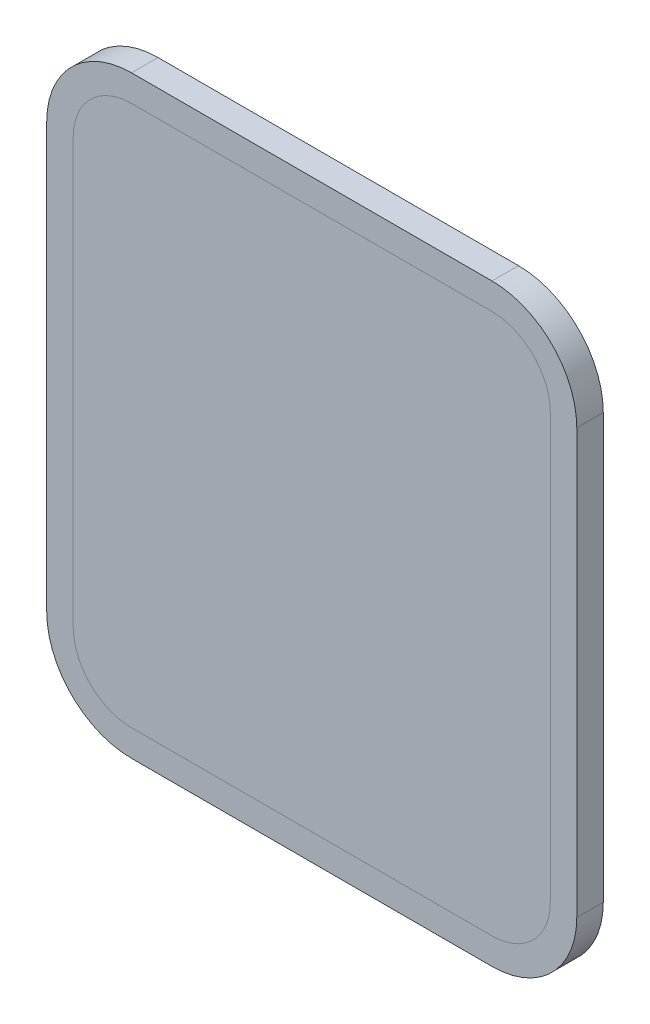
ISO-10303-21;
HEADER;
FILE_DESCRIPTION(('STEP AP214'),'2;1');
FILE_NAME('part.step','',(''),(''),'','','');
FILE_SCHEMA(('AUTOMOTIVE_DESIGN { 1 0 10303 214 1 1 1 1 }'));
ENDSEC;
DATA;
#1=APPLICATION_CONTEXT('core data for automotive mechanical design processes');
#2=APPLICATION_PROTOCOL_DEFINITION('international standard','automotive_design',2000,#1);
#3=PRODUCT_CONTEXT('',#1,'mechanical');
#4=PRODUCT('Part','Part','',(#3));
#5=PRODUCT_RELATED_PRODUCT_CATEGORY('part','',(#4));
#6=PRODUCT_DEFINITION_FORMATION('','',#4);
#7=PRODUCT_DEFINITION_CONTEXT('part definition',#1,'design');
#8=PRODUCT_DEFINITION('design','',#6,#7);
#9=PRODUCT_DEFINITION_SHAPE('','',#8);
#10=(LENGTH_UNIT() NAMED_UNIT(*) SI_UNIT(.MILLI.,.METRE.));
#11=(NAMED_UNIT(*) PLANE_ANGLE_UNIT() SI_UNIT($,.RADIAN.));
#12=(NAMED_UNIT(*) SI_UNIT($,.STERADIAN.) SOLID_ANGLE_UNIT());
#13=UNCERTAINTY_MEASURE_WITH_UNIT(LENGTH_MEASURE(1.E-05),#10,'distance_accuracy_value','');
#14=(GEOMETRIC_REPRESENTATION_CONTEXT(3) GLOBAL_UNCERTAINTY_ASSIGNED_CONTEXT((#13)) GLOBAL_UNIT_ASSIGNED_CONTEXT((#10,
#11,#12)) REPRESENTATION_CONTEXT('',''));
#15=CARTESIAN_POINT('',(0.,0.,0.));
#16=DIRECTION('',(0.,0.,1.));
#17=DIRECTION('',(1.,0.,0.));
#18=AXIS2_PLACEMENT_3D('',#15,#16,#17);
#19=CARTESIAN_POINT('',(160.,160.,0.));
#20=DIRECTION('',(0.,0.,1.));
#21=DIRECTION('',(1.,0.,0.));
#22=AXIS2_PLACEMENT_3D('',#19,#20,#21);
#23=CYLINDRICAL_SURFACE('',#22,110.);
#24=CARTESIAN_POINT('',(160.,160.,50.));
#25=DIRECTION('',(0.,0.,1.));
#26=DIRECTION('',(1.,0.,0.));
#27=AXIS2_PLACEMENT_3D('',#24,#25,#26);
#28=CIRCLE('',#27,110.);
#29=CARTESIAN_POINT('',(50.,160.000000000001,50.));
#30=VERTEX_POINT('',#29);
#31=CARTESIAN_POINT('',(160.000000000001,50.,50.));
#32=VERTEX_POINT('',#31);
#33=EDGE_CURVE('E141',#30,#32,#28,.T.);
#34=ORIENTED_EDGE('',*,*,#33,.F.);
#35=DIRECTION('',(0.,0.,1.));
#36=VECTOR('',#35,1.);
#37=CARTESIAN_POINT('',(50.,160.000000000001,0.));
#38=LINE('',#37,#36);
#39=CARTESIAN_POINT('',(50.,160.000000000001,0.));
#40=VERTEX_POINT('',#39);
#41=EDGE_CURVE('E12',#40,#30,#38,.T.);
#42=ORIENTED_EDGE('',*,*,#41,.F.);
#43=CARTESIAN_POINT('',(160.,160.,0.));
#44=DIRECTION('',(0.,0.,1.));
#45=DIRECTION('',(1.,0.,0.));
#46=AXIS2_PLACEMENT_3D('',#43,#44,#45);
#47=CIRCLE('',#46,110.);
#48=CARTESIAN_POINT('',(160.000000000001,50.,0.));
#49=VERTEX_POINT('',#48);
#50=EDGE_CURVE('E161',#40,#49,#47,.T.);
#51=ORIENTED_EDGE('',*,*,#50,.T.);
#52=DIRECTION('',(0.,0.,1.));
#53=VECTOR('',#52,1.);
#54=CARTESIAN_POINT('',(160.000000000001,50.,0.));
#55=LINE('',#54,#53);
#56=EDGE_CURVE('E47',#49,#32,#55,.T.);
#57=ORIENTED_EDGE('',*,*,#56,.T.);
#58=EDGE_LOOP('',(#34,#42,#51,#57));
#59=FACE_BOUND('',#58,.T.);
#60=ADVANCED_FACE('F44',(#59),#23,.T.);
#61=CARTESIAN_POINT('',(49.9999999999999,959.999999999999,0.));
#62=DIRECTION('',(-1.,0.,0.));
#63=DIRECTION('',(0.,-1.,0.));
#64=AXIS2_PLACEMENT_3D('',#61,#62,#63);
#65=PLANE('',#64);
#66=DIRECTION('',(0.,-1.,0.));
#67=VECTOR('',#66,1.);
#68=CARTESIAN_POINT('',(49.9999999999999,959.999999999999,50.));
#69=LINE('',#68,#67);
#70=CARTESIAN_POINT('',(49.9999999999999,959.999999999999,50.));
#71=VERTEX_POINT('',#70);
#72=EDGE_CURVE('E159',#71,#30,#69,.T.);
#73=ORIENTED_EDGE('',*,*,#72,.F.);
#74=DIRECTION('',(0.,0.,1.));
#75=VECTOR('',#74,1.);
#76=CARTESIAN_POINT('',(49.9999999999999,959.999999999999,0.));
#77=LINE('',#76,#75);
#78=CARTESIAN_POINT('',(49.9999999999999,959.999999999999,0.));
#79=VERTEX_POINT('',#78);
#80=EDGE_CURVE('E53',#79,#71,#77,.T.);
#81=ORIENTED_EDGE('',*,*,#80,.F.);
#82=DIRECTION('',(0.,-1.,0.));
#83=VECTOR('',#82,1.);
#84=CARTESIAN_POINT('',(49.9999999999999,959.999999999999,0.));
#85=LINE('',#84,#83);
#86=EDGE_CURVE('E131',#79,#40,#85,.T.);
#87=ORIENTED_EDGE('',*,*,#86,.T.);
#88=ORIENTED_EDGE('',*,*,#41,.T.);
#89=EDGE_LOOP('',(#73,#81,#87,#88));
#90=FACE_BOUND('',#89,.T.);
#91=ADVANCED_FACE('F173',(#90),#65,.T.);
#92=CARTESIAN_POINT('',(160.,960.,0.));
#93=DIRECTION('',(0.,0.,1.));
#94=DIRECTION('',(1.,0.,0.));
#95=AXIS2_PLACEMENT_3D('',#92,#93,#94);
#96=CYLINDRICAL_SURFACE('',#95,110.);
#97=CARTESIAN_POINT('',(160.,960.,50.));
#98=DIRECTION('',(0.,0.,1.));
#99=DIRECTION('',(1.,0.,0.));
#100=AXIS2_PLACEMENT_3D('',#97,#98,#99);
#101=CIRCLE('',#100,110.);
#102=CARTESIAN_POINT('',(160.000000000001,1070.,50.));
#103=VERTEX_POINT('',#102);
#104=EDGE_CURVE('E118',#103,#71,#101,.T.);
#105=ORIENTED_EDGE('',*,*,#104,.F.);
#106=DIRECTION('',(0.,0.,1.));
#107=VECTOR('',#106,1.);
#108=CARTESIAN_POINT('',(160.000000000001,1070.,0.));
#109=LINE('',#108,#107);
#110=CARTESIAN_POINT('',(160.000000000001,1070.,0.));
#111=VERTEX_POINT('',#110);
#112=EDGE_CURVE('E113',#111,#103,#109,.T.);
#113=ORIENTED_EDGE('',*,*,#112,.F.);
#114=CARTESIAN_POINT('',(160.,960.,0.));
#115=DIRECTION('',(0.,0.,1.));
#116=DIRECTION('',(1.,0.,0.));
#117=AXIS2_PLACEMENT_3D('',#114,#115,#116);
#118=CIRCLE('',#117,110.);
#119=EDGE_CURVE('E116',#111,#79,#118,.T.);
#120=ORIENTED_EDGE('',*,*,#119,.T.);
#121=ORIENTED_EDGE('',*,*,#80,.T.);
#122=EDGE_LOOP('',(#105,#113,#120,#121));
#123=FACE_BOUND('',#122,.T.);
#124=ADVANCED_FACE('F115',(#123),#96,.T.);
#125=CARTESIAN_POINT('',(839.999999999999,1070.,0.));
#126=DIRECTION('',(0.,1.,0.));
#127=DIRECTION('',(0.,0.,1.));
#128=AXIS2_PLACEMENT_3D('',#125,#126,#127);
#129=PLANE('',#128);
#130=DIRECTION('',(-1.,0.,0.));
#131=VECTOR('',#130,1.);
#132=CARTESIAN_POINT('',(839.999999999999,1070.,50.));
#133=LINE('',#132,#131);
#134=CARTESIAN_POINT('',(839.999999999999,1070.,50.));
#135=VERTEX_POINT('',#134);
#136=EDGE_CURVE('E156',#135,#103,#133,.T.);
#137=ORIENTED_EDGE('',*,*,#136,.F.);
#138=DIRECTION('',(0.,0.,1.));
#139=VECTOR('',#138,1.);
#140=CARTESIAN_POINT('',(839.999999999999,1070.,0.));
#141=LINE('',#140,#139);
#142=CARTESIAN_POINT('',(839.999999999999,1070.,0.));
#143=VERTEX_POINT('',#142);
#144=EDGE_CURVE('E123',#143,#135,#141,.T.);
#145=ORIENTED_EDGE('',*,*,#144,.F.);
#146=DIRECTION('',(-1.,0.,0.));
#147=VECTOR('',#146,1.);
#148=CARTESIAN_POINT('',(839.999999999999,1070.,0.));
#149=LINE('',#148,#147);
#150=EDGE_CURVE('E129',#143,#111,#149,.T.);
#151=ORIENTED_EDGE('',*,*,#150,.T.);
#152=ORIENTED_EDGE('',*,*,#112,.T.);
#153=EDGE_LOOP('',(#137,#145,#151,#152));
#154=FACE_BOUND('',#153,.T.);
#155=ADVANCED_FACE('F133',(#154),#129,.T.);
#156=CARTESIAN_POINT('',(840.,960.,0.));
#157=DIRECTION('',(0.,0.,1.));
#158=DIRECTION('',(1.,0.,0.));
#159=AXIS2_PLACEMENT_3D('',#156,#157,#158);
#160=CYLINDRICAL_SURFACE('',#159,110.);
#161=CARTESIAN_POINT('',(840.,960.,50.));
#162=DIRECTION('',(0.,0.,1.));
#163=DIRECTION('',(1.,0.,0.));
#164=AXIS2_PLACEMENT_3D('',#161,#162,#163);
#165=CIRCLE('',#164,110.);
#166=CARTESIAN_POINT('',(950.,959.999999999999,50.));
#167=VERTEX_POINT('',#166);
#168=EDGE_CURVE('E153',#167,#135,#165,.T.);
#169=ORIENTED_EDGE('',*,*,#168,.F.);
#170=DIRECTION('',(0.,0.,1.));
#171=VECTOR('',#170,1.);
#172=CARTESIAN_POINT('',(950.,959.999999999999,0.));
#173=LINE('',#172,#171);
#174=CARTESIAN_POINT('',(950.,959.999999999999,0.));
#175=VERTEX_POINT('',#174);
#176=EDGE_CURVE('E165',#175,#167,#173,.T.);
#177=ORIENTED_EDGE('',*,*,#176,.F.);
#178=CARTESIAN_POINT('',(840.,960.,0.));
#179=DIRECTION('',(0.,0.,1.));
#180=DIRECTION('',(1.,0.,0.));
#181=AXIS2_PLACEMENT_3D('',#178,#179,#180);
#182=CIRCLE('',#181,110.);
#183=EDGE_CURVE('E134',#175,#143,#182,.T.);
#184=ORIENTED_EDGE('',*,*,#183,.T.);
#185=ORIENTED_EDGE('',*,*,#144,.T.);
#186=EDGE_LOOP('',(#169,#177,#184,#185));
#187=FACE_BOUND('',#186,.T.);
#188=ADVANCED_FACE('F186',(#187),#160,.T.);
#189=CARTESIAN_POINT('',(950.,160.000000000001,0.));
#190=DIRECTION('',(1.,0.,0.));
#191=DIRECTION('',(0.,0.,-1.));
#192=AXIS2_PLACEMENT_3D('',#189,#190,#191);
#193=PLANE('',#192);
#194=DIRECTION('',(0.,1.,0.));
#195=VECTOR('',#194,1.);
#196=CARTESIAN_POINT('',(950.,160.000000000001,50.));
#197=LINE('',#196,#195);
#198=CARTESIAN_POINT('',(950.,160.000000000001,50.));
#199=VERTEX_POINT('',#198);
#200=EDGE_CURVE('E150',#199,#167,#197,.T.);
#201=ORIENTED_EDGE('',*,*,#200,.F.);
#202=DIRECTION('',(0.,0.,1.));
#203=VECTOR('',#202,1.);
#204=CARTESIAN_POINT('',(950.,160.000000000001,0.));
#205=LINE('',#204,#203);
#206=CARTESIAN_POINT('',(950.,160.000000000001,0.));
#207=VERTEX_POINT('',#206);
#208=EDGE_CURVE('E167',#207,#199,#205,.T.);
#209=ORIENTED_EDGE('',*,*,#208,.F.);
#210=DIRECTION('',(0.,1.,0.));
#211=VECTOR('',#210,1.);
#212=CARTESIAN_POINT('',(950.,160.000000000001,0.));
#213=LINE('',#212,#211);
#214=EDGE_CURVE('E136',#207,#175,#213,.T.);
#215=ORIENTED_EDGE('',*,*,#214,.T.);
#216=ORIENTED_EDGE('',*,*,#176,.T.);
#217=EDGE_LOOP('',(#201,#209,#215,#216));
#218=FACE_BOUND('',#217,.T.);
#219=ADVANCED_FACE('F189',(#218),#193,.T.);
#220=CARTESIAN_POINT('',(840.,160.,0.));
#221=DIRECTION('',(0.,0.,1.));
#222=DIRECTION('',(1.,0.,0.));
#223=AXIS2_PLACEMENT_3D('',#220,#221,#222);
#224=CYLINDRICAL_SURFACE('',#223,110.);
#225=CARTESIAN_POINT('',(840.,160.,50.));
#226=DIRECTION('',(0.,0.,1.));
#227=DIRECTION('',(1.,0.,0.));
#228=AXIS2_PLACEMENT_3D('',#225,#226,#227);
#229=CIRCLE('',#228,110.);
#230=CARTESIAN_POINT('',(839.999999999999,50.,50.));
#231=VERTEX_POINT('',#230);
#232=EDGE_CURVE('E147',#231,#199,#229,.T.);
#233=ORIENTED_EDGE('',*,*,#232,.F.);
#234=DIRECTION('',(0.,0.,1.));
#235=VECTOR('',#234,1.);
#236=CARTESIAN_POINT('',(839.999999999999,50.,0.));
#237=LINE('',#236,#235);
#238=CARTESIAN_POINT('',(839.999999999999,50.,0.));
#239=VERTEX_POINT('',#238);
#240=EDGE_CURVE('E168',#239,#231,#237,.T.);
#241=ORIENTED_EDGE('',*,*,#240,.F.);
#242=CARTESIAN_POINT('',(840.,160.,0.));
#243=DIRECTION('',(0.,0.,1.));
#244=DIRECTION('',(1.,0.,0.));
#245=AXIS2_PLACEMENT_3D('',#242,#243,#244);
#246=CIRCLE('',#245,110.);
#247=EDGE_CURVE('E264',#239,#207,#246,.T.);
#248=ORIENTED_EDGE('',*,*,#247,.T.);
#249=ORIENTED_EDGE('',*,*,#208,.T.);
#250=EDGE_LOOP('',(#233,#241,#248,#249));
#251=FACE_BOUND('',#250,.T.);
#252=ADVANCED_FACE('F193',(#251),#224,.T.);
#253=CARTESIAN_POINT('',(160.000000000001,50.,0.));
#254=DIRECTION('',(0.,-1.,0.));
#255=DIRECTION('',(0.,0.,-1.));
#256=AXIS2_PLACEMENT_3D('',#253,#254,#255);
#257=PLANE('',#256);
#258=DIRECTION('',(1.,0.,0.));
#259=VECTOR('',#258,1.);
#260=CARTESIAN_POINT('',(160.000000000001,50.,50.));
#261=LINE('',#260,#259);
#262=EDGE_CURVE('E144',#32,#231,#261,.T.);
#263=ORIENTED_EDGE('',*,*,#262,.F.);
#264=ORIENTED_EDGE('',*,*,#56,.F.);
#265=DIRECTION('',(1.,0.,0.));
#266=VECTOR('',#265,1.);
#267=CARTESIAN_POINT('',(160.000000000001,50.,0.));
#268=LINE('',#267,#266);
#269=EDGE_CURVE('E265',#49,#239,#268,.T.);
#270=ORIENTED_EDGE('',*,*,#269,.T.);
#271=ORIENTED_EDGE('',*,*,#240,.T.);
#272=EDGE_LOOP('',(#263,#264,#270,#271));
#273=FACE_BOUND('',#272,.T.);
#274=ADVANCED_FACE('F170',(#273),#257,.T.);
#275=CARTESIAN_POINT('',(160.,160.,0.));
#276=DIRECTION('',(0.,0.,1.));
#277=DIRECTION('',(1.,0.,0.));
#278=AXIS2_PLACEMENT_3D('',#275,#276,#277);
#279=PLANE('',#278);
#280=ORIENTED_EDGE('',*,*,#50,.F.);
#281=ORIENTED_EDGE('',*,*,#86,.F.);
#282=ORIENTED_EDGE('',*,*,#119,.F.);
#283=ORIENTED_EDGE('',*,*,#150,.F.);
#284=ORIENTED_EDGE('',*,*,#183,.F.);
#285=ORIENTED_EDGE('',*,*,#214,.F.);
#286=ORIENTED_EDGE('',*,*,#247,.F.);
#287=ORIENTED_EDGE('',*,*,#269,.F.);
#288=EDGE_LOOP('',(#280,#281,#282,#283,#284,#285,#286,#287));
#289=FACE_BOUND('',#288,.T.);
#290=ADVANCED_FACE('F127',(#289),#279,.F.);
#291=CARTESIAN_POINT('',(160.,160.,50.));
#292=DIRECTION('',(0.,0.,1.));
#293=DIRECTION('',(1.,0.,0.));
#294=AXIS2_PLACEMENT_3D('',#291,#292,#293);
#295=PLANE('',#294);
#296=ORIENTED_EDGE('',*,*,#33,.T.);
#297=ORIENTED_EDGE('',*,*,#262,.T.);
#298=ORIENTED_EDGE('',*,*,#232,.T.);
#299=ORIENTED_EDGE('',*,*,#200,.T.);
#300=ORIENTED_EDGE('',*,*,#168,.T.);
#301=ORIENTED_EDGE('',*,*,#136,.T.);
#302=ORIENTED_EDGE('',*,*,#104,.T.);
#303=ORIENTED_EDGE('',*,*,#72,.T.);
#304=EDGE_LOOP('',(#296,#297,#298,#299,#300,#301,#302,#303));
#305=FACE_BOUND('',#304,.T.);
#306=ADVANCED_FACE('F172',(#305),#295,.T.);
#307=CLOSED_SHELL('',(#60,#91,#124,#155,#188,#219,#252,#274,#290,#306));
#308=MANIFOLD_SOLID_BREP('B2',#307);
#309=CARTESIAN_POINT('',(160.,160.,50.));
#310=DIRECTION('',(0.,0.,-1.));
#311=DIRECTION('',(-1.,0.,0.));
#312=AXIS2_PLACEMENT_3D('',#309,#310,#311);
#313=CYLINDRICAL_SURFACE('',#312,160.);
#314=CARTESIAN_POINT('',(160.,160.,0.));
#315=DIRECTION('',(0.,0.,1.));
#316=DIRECTION('',(-1.,0.,0.));
#317=AXIS2_PLACEMENT_3D('',#314,#315,#316);
#318=CIRCLE('',#317,160.);
#319=CARTESIAN_POINT('',(0.,160.000000000001,0.));
#320=VERTEX_POINT('',#319);
#321=CARTESIAN_POINT('',(160.000000000001,0.,0.));
#322=VERTEX_POINT('',#321);
#323=EDGE_CURVE('E389',#320,#322,#318,.T.);
#324=ORIENTED_EDGE('',*,*,#323,.T.);
#325=DIRECTION('',(0.,0.,-1.));
#326=VECTOR('',#325,1.);
#327=CARTESIAN_POINT('',(160.000000000001,0.,50.));
#328=LINE('',#327,#326);
#329=CARTESIAN_POINT('',(160.000000000001,0.,50.));
#330=VERTEX_POINT('',#329);
#331=EDGE_CURVE('E42',#330,#322,#328,.T.);
#332=ORIENTED_EDGE('',*,*,#331,.F.);
#333=CARTESIAN_POINT('',(160.,160.,50.));
#334=DIRECTION('',(0.,0.,1.));
#335=DIRECTION('',(-1.,0.,0.));
#336=AXIS2_PLACEMENT_3D('',#333,#334,#335);
#337=CIRCLE('',#336,160.);
#338=CARTESIAN_POINT('',(0.,160.000000000001,50.));
#339=VERTEX_POINT('',#338);
#340=EDGE_CURVE('E439',#339,#330,#337,.T.);
#341=ORIENTED_EDGE('',*,*,#340,.F.);
#342=DIRECTION('',(0.,0.,-1.));
#343=VECTOR('',#342,1.);
#344=CARTESIAN_POINT('',(0.,160.000000000001,50.));
#345=LINE('',#344,#343);
#346=EDGE_CURVE('E457',#339,#320,#345,.T.);
#347=ORIENTED_EDGE('',*,*,#346,.T.);
#348=EDGE_LOOP('',(#324,#332,#341,#347));
#349=FACE_BOUND('',#348,.T.);
#350=ADVANCED_FACE('F271',(#349),#313,.T.);
#351=CARTESIAN_POINT('',(160.000000000001,0.,50.));
#352=DIRECTION('',(0.,1.,0.));
#353=DIRECTION('',(0.,0.,1.));
#354=AXIS2_PLACEMENT_3D('',#351,#352,#353);
#355=PLANE('',#354);
#356=DIRECTION('',(1.,0.,0.));
#357=VECTOR('',#356,1.);
#358=CARTESIAN_POINT('',(160.000000000001,0.,0.));
#359=LINE('',#358,#357);
#360=CARTESIAN_POINT('',(839.999999999999,0.,0.));
#361=VERTEX_POINT('',#360);
#362=EDGE_CURVE('E460',#322,#361,#359,.T.);
#363=ORIENTED_EDGE('',*,*,#362,.T.);
#364=DIRECTION('',(0.,0.,-1.));
#365=VECTOR('',#364,1.);
#366=CARTESIAN_POINT('',(839.999999999999,0.,50.));
#367=LINE('',#366,#365);
#368=CARTESIAN_POINT('',(839.999999999999,0.,50.));
#369=VERTEX_POINT('',#368);
#370=EDGE_CURVE('E278',#369,#361,#367,.T.);
#371=ORIENTED_EDGE('',*,*,#370,.F.);
#372=DIRECTION('',(1.,0.,0.));
#373=VECTOR('',#372,1.);
#374=CARTESIAN_POINT('',(160.000000000001,0.,50.));
#375=LINE('',#374,#373);
#376=EDGE_CURVE('E442',#330,#369,#375,.T.);
#377=ORIENTED_EDGE('',*,*,#376,.F.);
#378=ORIENTED_EDGE('',*,*,#331,.T.);
#379=EDGE_LOOP('',(#363,#371,#377,#378));
#380=FACE_BOUND('',#379,.T.);
#381=ADVANCED_FACE('F515',(#380),#355,.F.);
#382=CARTESIAN_POINT('',(840.,160.,50.));
#383=DIRECTION('',(0.,0.,-1.));
#384=DIRECTION('',(-1.,0.,0.));
#385=AXIS2_PLACEMENT_3D('',#382,#383,#384);
#386=CYLINDRICAL_SURFACE('',#385,160.);
#387=CARTESIAN_POINT('',(840.,160.,0.));
#388=DIRECTION('',(0.,0.,1.));
#389=DIRECTION('',(1.,0.,0.));
#390=AXIS2_PLACEMENT_3D('',#387,#388,#389);
#391=CIRCLE('',#390,160.);
#392=CARTESIAN_POINT('',(1000.,160.000000000001,0.));
#393=VERTEX_POINT('',#392);
#394=EDGE_CURVE('E462',#361,#393,#391,.T.);
#395=ORIENTED_EDGE('',*,*,#394,.T.);
#396=DIRECTION('',(0.,0.,-1.));
#397=VECTOR('',#396,1.);
#398=CARTESIAN_POINT('',(1000.,160.000000000001,50.));
#399=LINE('',#398,#397);
#400=CARTESIAN_POINT('',(1000.,160.000000000001,50.));
#401=VERTEX_POINT('',#400);
#402=EDGE_CURVE('E487',#401,#393,#399,.T.);
#403=ORIENTED_EDGE('',*,*,#402,.F.);
#404=CARTESIAN_POINT('',(840.,160.,50.));
#405=DIRECTION('',(0.,0.,1.));
#406=DIRECTION('',(1.,0.,0.));
#407=AXIS2_PLACEMENT_3D('',#404,#405,#406);
#408=CIRCLE('',#407,160.);
#409=EDGE_CURVE('E445',#369,#401,#408,.T.);
#410=ORIENTED_EDGE('',*,*,#409,.F.);
#411=ORIENTED_EDGE('',*,*,#370,.T.);
#412=EDGE_LOOP('',(#395,#403,#410,#411));
#413=FACE_BOUND('',#412,.T.);
#414=ADVANCED_FACE('F494',(#413),#386,.T.);
#415=CARTESIAN_POINT('',(1000.,160.000000000001,50.));
#416=DIRECTION('',(-1.,0.,0.));
#417=DIRECTION('',(0.,0.,1.));
#418=AXIS2_PLACEMENT_3D('',#415,#416,#417);
#419=PLANE('',#418);
#420=DIRECTION('',(0.,1.,0.));
#421=VECTOR('',#420,1.);
#422=CARTESIAN_POINT('',(1000.,160.000000000001,0.));
#423=LINE('',#422,#421);
#424=CARTESIAN_POINT('',(1000.,959.999999999999,0.));
#425=VERTEX_POINT('',#424);
#426=EDGE_CURVE('E464',#393,#425,#423,.T.);
#427=ORIENTED_EDGE('',*,*,#426,.T.);
#428=DIRECTION('',(0.,0.,-1.));
#429=VECTOR('',#428,1.);
#430=CARTESIAN_POINT('',(1000.,959.999999999999,50.));
#431=LINE('',#430,#429);
#432=CARTESIAN_POINT('',(1000.,959.999999999999,50.));
#433=VERTEX_POINT('',#432);
#434=EDGE_CURVE('E484',#433,#425,#431,.T.);
#435=ORIENTED_EDGE('',*,*,#434,.F.);
#436=DIRECTION('',(0.,1.,0.));
#437=VECTOR('',#436,1.);
#438=CARTESIAN_POINT('',(1000.,160.000000000001,50.));
#439=LINE('',#438,#437);
#440=EDGE_CURVE('E447',#401,#433,#439,.T.);
#441=ORIENTED_EDGE('',*,*,#440,.F.);
#442=ORIENTED_EDGE('',*,*,#402,.T.);
#443=EDGE_LOOP('',(#427,#435,#441,#442));
#444=FACE_BOUND('',#443,.T.);
#445=ADVANCED_FACE('F503',(#444),#419,.F.);
#446=CARTESIAN_POINT('',(840.,960.,50.));
#447=DIRECTION('',(0.,0.,-1.));
#448=DIRECTION('',(-1.,0.,0.));
#449=AXIS2_PLACEMENT_3D('',#446,#447,#448);
#450=CYLINDRICAL_SURFACE('',#449,160.);
#451=CARTESIAN_POINT('',(840.,960.,0.));
#452=DIRECTION('',(0.,0.,1.));
#453=DIRECTION('',(1.,0.,0.));
#454=AXIS2_PLACEMENT_3D('',#451,#452,#453);
#455=CIRCLE('',#454,160.);
#456=CARTESIAN_POINT('',(839.999999999999,1120.,0.));
#457=VERTEX_POINT('',#456);
#458=EDGE_CURVE('E466',#425,#457,#455,.T.);
#459=ORIENTED_EDGE('',*,*,#458,.T.);
#460=DIRECTION('',(0.,0.,-1.));
#461=VECTOR('',#460,1.);
#462=CARTESIAN_POINT('',(839.999999999999,1120.,50.));
#463=LINE('',#462,#461);
#464=CARTESIAN_POINT('',(839.999999999999,1120.,50.));
#465=VERTEX_POINT('',#464);
#466=EDGE_CURVE('E481',#465,#457,#463,.T.);
#467=ORIENTED_EDGE('',*,*,#466,.F.);
#468=CARTESIAN_POINT('',(840.,960.,50.));
#469=DIRECTION('',(0.,0.,1.));
#470=DIRECTION('',(1.,0.,0.));
#471=AXIS2_PLACEMENT_3D('',#468,#469,#470);
#472=CIRCLE('',#471,160.);
#473=EDGE_CURVE('E449',#433,#465,#472,.T.);
#474=ORIENTED_EDGE('',*,*,#473,.F.);
#475=ORIENTED_EDGE('',*,*,#434,.T.);
#476=EDGE_LOOP('',(#459,#467,#474,#475));
#477=FACE_BOUND('',#476,.T.);
#478=ADVANCED_FACE('F507',(#477),#450,.T.);
#479=CARTESIAN_POINT('',(839.999999999999,1120.,50.));
#480=DIRECTION('',(0.,-1.,0.));
#481=DIRECTION('',(0.,0.,-1.));
#482=AXIS2_PLACEMENT_3D('',#479,#480,#481);
#483=PLANE('',#482);
#484=DIRECTION('',(-1.,0.,0.));
#485=VECTOR('',#484,1.);
#486=CARTESIAN_POINT('',(839.999999999999,1120.,0.));
#487=LINE('',#486,#485);
#488=CARTESIAN_POINT('',(160.000000000001,1120.,0.));
#489=VERTEX_POINT('',#488);
#490=EDGE_CURVE('E468',#457,#489,#487,.T.);
#491=ORIENTED_EDGE('',*,*,#490,.T.);
#492=DIRECTION('',(0.,0.,-1.));
#493=VECTOR('',#492,1.);
#494=CARTESIAN_POINT('',(160.000000000001,1120.,50.));
#495=LINE('',#494,#493);
#496=CARTESIAN_POINT('',(160.000000000001,1120.,50.));
#497=VERTEX_POINT('',#496);
#498=EDGE_CURVE('E478',#497,#489,#495,.T.);
#499=ORIENTED_EDGE('',*,*,#498,.F.);
#500=DIRECTION('',(-1.,0.,0.));
#501=VECTOR('',#500,1.);
#502=CARTESIAN_POINT('',(839.999999999999,1120.,50.));
#503=LINE('',#502,#501);
#504=EDGE_CURVE('E451',#465,#497,#503,.T.);
#505=ORIENTED_EDGE('',*,*,#504,.F.);
#506=ORIENTED_EDGE('',*,*,#466,.T.);
#507=EDGE_LOOP('',(#491,#499,#505,#506));
#508=FACE_BOUND('',#507,.T.);
#509=ADVANCED_FACE('F528',(#508),#483,.F.);
#510=CARTESIAN_POINT('',(160.,960.,50.));
#511=DIRECTION('',(0.,0.,-1.));
#512=DIRECTION('',(-1.,0.,0.));
#513=AXIS2_PLACEMENT_3D('',#510,#511,#512);
#514=CYLINDRICAL_SURFACE('',#513,160.);
#515=CARTESIAN_POINT('',(160.,960.,0.));
#516=DIRECTION('',(0.,0.,1.));
#517=DIRECTION('',(1.,0.,0.));
#518=AXIS2_PLACEMENT_3D('',#515,#516,#517);
#519=CIRCLE('',#518,160.);
#520=CARTESIAN_POINT('',(-1.38777878078145E-13,959.999999999999,0.));
#521=VERTEX_POINT('',#520);
#522=EDGE_CURVE('E470',#489,#521,#519,.T.);
#523=ORIENTED_EDGE('',*,*,#522,.T.);
#524=DIRECTION('',(0.,0.,-1.));
#525=VECTOR('',#524,1.);
#526=CARTESIAN_POINT('',(-1.38777878078145E-13,959.999999999999,50.));
#527=LINE('',#526,#525);
#528=CARTESIAN_POINT('',(-1.38777878078145E-13,959.999999999999,50.));
#529=VERTEX_POINT('',#528);
#530=EDGE_CURVE('E475',#529,#521,#527,.T.);
#531=ORIENTED_EDGE('',*,*,#530,.F.);
#532=CARTESIAN_POINT('',(160.,960.,50.));
#533=DIRECTION('',(0.,0.,1.));
#534=DIRECTION('',(1.,0.,0.));
#535=AXIS2_PLACEMENT_3D('',#532,#533,#534);
#536=CIRCLE('',#535,160.);
#537=EDGE_CURVE('E453',#497,#529,#536,.T.);
#538=ORIENTED_EDGE('',*,*,#537,.F.);
#539=ORIENTED_EDGE('',*,*,#498,.T.);
#540=EDGE_LOOP('',(#523,#531,#538,#539));
#541=FACE_BOUND('',#540,.T.);
#542=ADVANCED_FACE('F526',(#541),#514,.T.);
#543=CARTESIAN_POINT('',(-1.09222987592768E-13,959.999999999999,50.));
#544=DIRECTION('',(1.,0.,0.));
#545=DIRECTION('',(0.,1.,0.));
#546=AXIS2_PLACEMENT_3D('',#543,#544,#545);
#547=PLANE('',#546);
#548=DIRECTION('',(0.,-1.,0.));
#549=VECTOR('',#548,1.);
#550=CARTESIAN_POINT('',(-1.09222987592768E-13,959.999999999999,0.));
#551=LINE('',#550,#549);
#552=EDGE_CURVE('E443',#521,#320,#551,.T.);
#553=ORIENTED_EDGE('',*,*,#552,.T.);
#554=ORIENTED_EDGE('',*,*,#346,.F.);
#555=DIRECTION('',(0.,-1.,0.));
#556=VECTOR('',#555,1.);
#557=CARTESIAN_POINT('',(-1.09222987592768E-13,959.999999999999,50.));
#558=LINE('',#557,#556);
#559=EDGE_CURVE('E455',#529,#339,#558,.T.);
#560=ORIENTED_EDGE('',*,*,#559,.F.);
#561=ORIENTED_EDGE('',*,*,#530,.T.);
#562=EDGE_LOOP('',(#553,#554,#560,#561));
#563=FACE_BOUND('',#562,.T.);
#564=ADVANCED_FACE('F521',(#563),#547,.F.);
#565=CARTESIAN_POINT('',(160.,160.,50.));
#566=DIRECTION('',(0.,0.,-1.));
#567=DIRECTION('',(-1.,0.,0.));
#568=AXIS2_PLACEMENT_3D('',#565,#566,#567);
#569=PLANE('',#568);
#570=DIRECTION('',(1.,0.,0.));
#571=VECTOR('',#570,1.);
#572=CARTESIAN_POINT('',(160.000000000001,50.,50.));
#573=LINE('',#572,#571);
#574=CARTESIAN_POINT('',(160.000000000001,50.,50.));
#575=VERTEX_POINT('',#574);
#576=CARTESIAN_POINT('',(839.999999999999,50.,50.));
#577=VERTEX_POINT('',#576);
#578=EDGE_CURVE('E403',#575,#577,#573,.T.);
#579=ORIENTED_EDGE('',*,*,#578,.F.);
#580=CARTESIAN_POINT('',(160.,160.,50.));
#581=DIRECTION('',(0.,0.,1.));
#582=DIRECTION('',(1.,0.,0.));
#583=AXIS2_PLACEMENT_3D('',#580,#581,#582);
#584=CIRCLE('',#583,110.);
#585=CARTESIAN_POINT('',(50.,160.000000000001,50.));
#586=VERTEX_POINT('',#585);
#587=EDGE_CURVE('E285',#586,#575,#584,.T.);
#588=ORIENTED_EDGE('',*,*,#587,.F.);
#589=DIRECTION('',(0.,-1.,0.));
#590=VECTOR('',#589,1.);
#591=CARTESIAN_POINT('',(49.9999999999999,959.999999999999,50.));
#592=LINE('',#591,#590);
#593=CARTESIAN_POINT('',(49.9999999999999,959.999999999999,50.));
#594=VERTEX_POINT('',#593);
#595=EDGE_CURVE('E395',#594,#586,#592,.T.);
#596=ORIENTED_EDGE('',*,*,#595,.F.);
#597=CARTESIAN_POINT('',(160.,960.,50.));
#598=DIRECTION('',(0.,0.,1.));
#599=DIRECTION('',(1.,0.,0.));
#600=AXIS2_PLACEMENT_3D('',#597,#598,#599);
#601=CIRCLE('',#600,110.);
#602=CARTESIAN_POINT('',(160.000000000001,1070.,50.));
#603=VERTEX_POINT('',#602);
#604=EDGE_CURVE('E422',#603,#594,#601,.T.);
#605=ORIENTED_EDGE('',*,*,#604,.F.);
#606=DIRECTION('',(-1.,0.,0.));
#607=VECTOR('',#606,1.);
#608=CARTESIAN_POINT('',(839.999999999999,1070.,50.));
#609=LINE('',#608,#607);
#610=CARTESIAN_POINT('',(839.999999999999,1070.,50.));
#611=VERTEX_POINT('',#610);
#612=EDGE_CURVE('E419',#611,#603,#609,.T.);
#613=ORIENTED_EDGE('',*,*,#612,.F.);
#614=CARTESIAN_POINT('',(840.,960.,50.));
#615=DIRECTION('',(0.,0.,1.));
#616=DIRECTION('',(1.,0.,0.));
#617=AXIS2_PLACEMENT_3D('',#614,#615,#616);
#618=CIRCLE('',#617,110.);
#619=CARTESIAN_POINT('',(950.,959.999999999999,50.));
#620=VERTEX_POINT('',#619);
#621=EDGE_CURVE('E416',#620,#611,#618,.T.);
#622=ORIENTED_EDGE('',*,*,#621,.F.);
#623=DIRECTION('',(0.,1.,0.));
#624=VECTOR('',#623,1.);
#625=CARTESIAN_POINT('',(950.,160.000000000001,50.));
#626=LINE('',#625,#624);
#627=CARTESIAN_POINT('',(950.,160.000000000001,50.));
#628=VERTEX_POINT('',#627);
#629=EDGE_CURVE('E413',#628,#620,#626,.T.);
#630=ORIENTED_EDGE('',*,*,#629,.F.);
#631=CARTESIAN_POINT('',(840.,160.,50.));
#632=DIRECTION('',(0.,0.,1.));
#633=DIRECTION('',(1.,0.,0.));
#634=AXIS2_PLACEMENT_3D('',#631,#632,#633);
#635=CIRCLE('',#634,110.);
#636=EDGE_CURVE('E410',#577,#628,#635,.T.);
#637=ORIENTED_EDGE('',*,*,#636,.F.);
#638=EDGE_LOOP('',(#579,#588,#596,#605,#613,#622,#630,#637));
#639=FACE_BOUND('',#638,.T.);
#640=ORIENTED_EDGE('',*,*,#340,.T.);
#641=ORIENTED_EDGE('',*,*,#376,.T.);
#642=ORIENTED_EDGE('',*,*,#409,.T.);
#643=ORIENTED_EDGE('',*,*,#440,.T.);
#644=ORIENTED_EDGE('',*,*,#473,.T.);
#645=ORIENTED_EDGE('',*,*,#504,.T.);
#646=ORIENTED_EDGE('',*,*,#537,.T.);
#647=ORIENTED_EDGE('',*,*,#559,.T.);
#648=EDGE_LOOP('',(#640,#641,#642,#643,#644,#645,#646,#647));
#649=FACE_BOUND('',#648,.T.);
#650=ADVANCED_FACE('F511',(#639,#649),#569,.F.);
#651=CARTESIAN_POINT('',(160.,160.,0.));
#652=DIRECTION('',(0.,0.,-1.));
#653=DIRECTION('',(-1.,0.,0.));
#654=AXIS2_PLACEMENT_3D('',#651,#652,#653);
#655=PLANE('',#654);
#656=CARTESIAN_POINT('',(160.,160.,0.));
#657=DIRECTION('',(0.,0.,-1.));
#658=DIRECTION('',(-1.,0.,0.));
#659=AXIS2_PLACEMENT_3D('',#656,#657,#658);
#660=CIRCLE('',#659,110.);
#661=CARTESIAN_POINT('',(50.,160.000000000001,0.));
#662=VERTEX_POINT('',#661);
#663=CARTESIAN_POINT('',(160.000000000001,50.,0.));
#664=VERTEX_POINT('',#663);
#665=EDGE_CURVE('E393',#662,#664,#660,.F.);
#666=ORIENTED_EDGE('',*,*,#665,.T.);
#667=DIRECTION('',(1.,0.,0.));
#668=VECTOR('',#667,1.);
#669=CARTESIAN_POINT('',(160.000000000001,50.,0.));
#670=LINE('',#669,#668);
#671=CARTESIAN_POINT('',(839.999999999999,50.,0.));
#672=VERTEX_POINT('',#671);
#673=EDGE_CURVE('E382',#664,#672,#670,.T.);
#674=ORIENTED_EDGE('',*,*,#673,.T.);
#675=CARTESIAN_POINT('',(840.,160.,0.));
#676=DIRECTION('',(0.,0.,-1.));
#677=DIRECTION('',(-1.,0.,0.));
#678=AXIS2_PLACEMENT_3D('',#675,#676,#677);
#679=CIRCLE('',#678,110.);
#680=CARTESIAN_POINT('',(950.,160.000000000001,0.));
#681=VERTEX_POINT('',#680);
#682=EDGE_CURVE('E673',#672,#681,#679,.F.);
#683=ORIENTED_EDGE('',*,*,#682,.T.);
#684=DIRECTION('',(0.,1.,0.));
#685=VECTOR('',#684,1.);
#686=CARTESIAN_POINT('',(950.,160.000000000001,0.));
#687=LINE('',#686,#685);
#688=CARTESIAN_POINT('',(950.,959.999999999999,0.));
#689=VERTEX_POINT('',#688);
#690=EDGE_CURVE('E678',#681,#689,#687,.T.);
#691=ORIENTED_EDGE('',*,*,#690,.T.);
#692=CARTESIAN_POINT('',(840.,960.,0.));
#693=DIRECTION('',(0.,0.,-1.));
#694=DIRECTION('',(-1.,0.,0.));
#695=AXIS2_PLACEMENT_3D('',#692,#693,#694);
#696=CIRCLE('',#695,110.);
#697=CARTESIAN_POINT('',(839.999999999999,1070.,0.));
#698=VERTEX_POINT('',#697);
#699=EDGE_CURVE('E681',#689,#698,#696,.F.);
#700=ORIENTED_EDGE('',*,*,#699,.T.);
#701=DIRECTION('',(-1.,0.,0.));
#702=VECTOR('',#701,1.);
#703=CARTESIAN_POINT('',(839.999999999999,1070.,0.));
#704=LINE('',#703,#702);
#705=CARTESIAN_POINT('',(160.000000000001,1070.,0.));
#706=VERTEX_POINT('',#705);
#707=EDGE_CURVE('E685',#698,#706,#704,.T.);
#708=ORIENTED_EDGE('',*,*,#707,.T.);
#709=CARTESIAN_POINT('',(160.,960.,0.));
#710=DIRECTION('',(0.,0.,-1.));
#711=DIRECTION('',(-1.,0.,0.));
#712=AXIS2_PLACEMENT_3D('',#709,#710,#711);
#713=CIRCLE('',#712,110.);
#714=CARTESIAN_POINT('',(49.9999999999999,960.,0.));
#715=VERTEX_POINT('',#714);
#716=EDGE_CURVE('E405',#706,#715,#713,.F.);
#717=ORIENTED_EDGE('',*,*,#716,.T.);
#718=DIRECTION('',(0.,-1.,0.));
#719=VECTOR('',#718,1.);
#720=CARTESIAN_POINT('',(49.9999999999999,959.999999999999,0.));
#721=LINE('',#720,#719);
#722=EDGE_CURVE('E401',#715,#662,#721,.T.);
#723=ORIENTED_EDGE('',*,*,#722,.T.);
#724=EDGE_LOOP('',(#666,#674,#683,#691,#700,#708,#717,#723));
#725=FACE_BOUND('',#724,.T.);
#726=ORIENTED_EDGE('',*,*,#323,.F.);
#727=ORIENTED_EDGE('',*,*,#552,.F.);
#728=ORIENTED_EDGE('',*,*,#522,.F.);
#729=ORIENTED_EDGE('',*,*,#490,.F.);
#730=ORIENTED_EDGE('',*,*,#458,.F.);
#731=ORIENTED_EDGE('',*,*,#426,.F.);
#732=ORIENTED_EDGE('',*,*,#394,.F.);
#733=ORIENTED_EDGE('',*,*,#362,.F.);
#734=EDGE_LOOP('',(#726,#727,#728,#729,#730,#731,#732,#733));
#735=FACE_BOUND('',#734,.T.);
#736=ADVANCED_FACE('F398',(#725,#735),#655,.T.);
#737=CARTESIAN_POINT('',(160.,160.,-0.001000000000001));
#738=DIRECTION('',(0.,0.,1.));
#739=DIRECTION('',(1.,0.,0.));
#740=AXIS2_PLACEMENT_3D('',#737,#738,#739);
#741=CYLINDRICAL_SURFACE('',#740,110.);
#742=DIRECTION('',(0.,0.,1.));
#743=VECTOR('',#742,1.);
#744=CARTESIAN_POINT('',(50.,160.000000000001,-0.001000000000001));
#745=LINE('',#744,#743);
#746=EDGE_CURVE('E390',#662,#586,#745,.T.);
#747=ORIENTED_EDGE('',*,*,#746,.T.);
#748=ORIENTED_EDGE('',*,*,#587,.T.);
#749=DIRECTION('',(0.,0.,1.));
#750=VECTOR('',#749,1.);
#751=CARTESIAN_POINT('',(160.000000000001,50.,-0.001000000000001));
#752=LINE('',#751,#750);
#753=EDGE_CURVE('E384',#664,#575,#752,.T.);
#754=ORIENTED_EDGE('',*,*,#753,.F.);
#755=ORIENTED_EDGE('',*,*,#665,.F.);
#756=EDGE_LOOP('',(#747,#748,#754,#755));
#757=FACE_BOUND('',#756,.T.);
#758=ADVANCED_FACE('F392',(#757),#741,.F.);
#759=CARTESIAN_POINT('',(49.9999999999999,959.999999999999,-0.001000000000001));
#760=DIRECTION('',(-1.,0.,0.));
#761=DIRECTION('',(0.,-1.,0.));
#762=AXIS2_PLACEMENT_3D('',#759,#760,#761);
#763=PLANE('',#762);
#764=DIRECTION('',(0.,0.,1.));
#765=VECTOR('',#764,1.);
#766=CARTESIAN_POINT('',(49.9999999999999,959.999999999999,-0.001000000000001));
#767=LINE('',#766,#765);
#768=EDGE_CURVE('E428',#715,#594,#767,.T.);
#769=ORIENTED_EDGE('',*,*,#768,.T.);
#770=ORIENTED_EDGE('',*,*,#595,.T.);
#771=ORIENTED_EDGE('',*,*,#746,.F.);
#772=ORIENTED_EDGE('',*,*,#722,.F.);
#773=EDGE_LOOP('',(#769,#770,#771,#772));
#774=FACE_BOUND('',#773,.T.);
#775=ADVANCED_FACE('F599',(#774),#763,.F.);
#776=CARTESIAN_POINT('',(160.,960.,-0.001000000000001));
#777=DIRECTION('',(0.,0.,1.));
#778=DIRECTION('',(1.,0.,0.));
#779=AXIS2_PLACEMENT_3D('',#776,#777,#778);
#780=CYLINDRICAL_SURFACE('',#779,110.);
#781=DIRECTION('',(0.,0.,1.));
#782=VECTOR('',#781,1.);
#783=CARTESIAN_POINT('',(160.000000000001,1070.,-0.001000000000001));
#784=LINE('',#783,#782);
#785=EDGE_CURVE('E430',#706,#603,#784,.T.);
#786=ORIENTED_EDGE('',*,*,#785,.T.);
#787=ORIENTED_EDGE('',*,*,#604,.T.);
#788=ORIENTED_EDGE('',*,*,#768,.F.);
#789=ORIENTED_EDGE('',*,*,#716,.F.);
#790=EDGE_LOOP('',(#786,#787,#788,#789));
#791=FACE_BOUND('',#790,.T.);
#792=ADVANCED_FACE('F608',(#791),#780,.F.);
#793=CARTESIAN_POINT('',(839.999999999999,1070.,-0.001000000000001));
#794=DIRECTION('',(0.,1.,0.));
#795=DIRECTION('',(0.,0.,1.));
#796=AXIS2_PLACEMENT_3D('',#793,#794,#795);
#797=PLANE('',#796);
#798=DIRECTION('',(0.,0.,1.));
#799=VECTOR('',#798,1.);
#800=CARTESIAN_POINT('',(839.999999999999,1070.,-0.001000000000001));
#801=LINE('',#800,#799);
#802=EDGE_CURVE('E432',#698,#611,#801,.T.);
#803=ORIENTED_EDGE('',*,*,#802,.T.);
#804=ORIENTED_EDGE('',*,*,#612,.T.);
#805=ORIENTED_EDGE('',*,*,#785,.F.);
#806=ORIENTED_EDGE('',*,*,#707,.F.);
#807=EDGE_LOOP('',(#803,#804,#805,#806));
#808=FACE_BOUND('',#807,.T.);
#809=ADVANCED_FACE('F618',(#808),#797,.F.);
#810=CARTESIAN_POINT('',(840.,960.,-0.001000000000001));
#811=DIRECTION('',(0.,0.,1.));
#812=DIRECTION('',(1.,0.,0.));
#813=AXIS2_PLACEMENT_3D('',#810,#811,#812);
#814=CYLINDRICAL_SURFACE('',#813,110.);
#815=DIRECTION('',(0.,0.,1.));
#816=VECTOR('',#815,1.);
#817=CARTESIAN_POINT('',(950.,959.999999999999,-0.001000000000001));
#818=LINE('',#817,#816);
#819=EDGE_CURVE('E434',#689,#620,#818,.T.);
#820=ORIENTED_EDGE('',*,*,#819,.T.);
#821=ORIENTED_EDGE('',*,*,#621,.T.);
#822=ORIENTED_EDGE('',*,*,#802,.F.);
#823=ORIENTED_EDGE('',*,*,#699,.F.);
#824=EDGE_LOOP('',(#820,#821,#822,#823));
#825=FACE_BOUND('',#824,.T.);
#826=ADVANCED_FACE('F628',(#825),#814,.F.);
#827=CARTESIAN_POINT('',(950.,160.000000000001,-0.001000000000001));
#828=DIRECTION('',(1.,0.,0.));
#829=DIRECTION('',(0.,0.,-1.));
#830=AXIS2_PLACEMENT_3D('',#827,#828,#829);
#831=PLANE('',#830);
#832=DIRECTION('',(0.,0.,1.));
#833=VECTOR('',#832,1.);
#834=CARTESIAN_POINT('',(950.,160.000000000001,-0.001000000000001));
#835=LINE('',#834,#833);
#836=EDGE_CURVE('E436',#681,#628,#835,.T.);
#837=ORIENTED_EDGE('',*,*,#836,.T.);
#838=ORIENTED_EDGE('',*,*,#629,.T.);
#839=ORIENTED_EDGE('',*,*,#819,.F.);
#840=ORIENTED_EDGE('',*,*,#690,.F.);
#841=EDGE_LOOP('',(#837,#838,#839,#840));
#842=FACE_BOUND('',#841,.T.);
#843=ADVANCED_FACE('F638',(#842),#831,.F.);
#844=CARTESIAN_POINT('',(840.,160.,-0.001000000000001));
#845=DIRECTION('',(0.,0.,1.));
#846=DIRECTION('',(1.,0.,0.));
#847=AXIS2_PLACEMENT_3D('',#844,#845,#846);
#848=CYLINDRICAL_SURFACE('',#847,110.);
#849=DIRECTION('',(0.,0.,1.));
#850=VECTOR('',#849,1.);
#851=CARTESIAN_POINT('',(839.999999999999,50.,-0.001000000000001));
#852=LINE('',#851,#850);
#853=EDGE_CURVE('E293',#672,#577,#852,.T.);
#854=ORIENTED_EDGE('',*,*,#853,.T.);
#855=ORIENTED_EDGE('',*,*,#636,.T.);
#856=ORIENTED_EDGE('',*,*,#836,.F.);
#857=ORIENTED_EDGE('',*,*,#682,.F.);
#858=EDGE_LOOP('',(#854,#855,#856,#857));
#859=FACE_BOUND('',#858,.T.);
#860=ADVANCED_FACE('F648',(#859),#848,.F.);
#861=CARTESIAN_POINT('',(160.000000000001,50.,-0.001000000000001));
#862=DIRECTION('',(0.,-1.,0.));
#863=DIRECTION('',(0.,0.,-1.));
#864=AXIS2_PLACEMENT_3D('',#861,#862,#863);
#865=PLANE('',#864);
#866=ORIENTED_EDGE('',*,*,#753,.T.);
#867=ORIENTED_EDGE('',*,*,#578,.T.);
#868=ORIENTED_EDGE('',*,*,#853,.F.);
#869=ORIENTED_EDGE('',*,*,#673,.F.);
#870=EDGE_LOOP('',(#866,#867,#868,#869));
#871=FACE_BOUND('',#870,.T.);
#872=ADVANCED_FACE('F383',(#871),#865,.F.);
#873=CLOSED_SHELL('',(#350,#381,#414,#445,#478,#509,#542,#564,#650,#736,#758,#775,#792,#809,
#826,#843,#860,#872));
#874=MANIFOLD_SOLID_BREP('B6',#873);
#875=ADVANCED_BREP_SHAPE_REPRESENTATION('',(#18,#308,#874),#14);
#876=SHAPE_DEFINITION_REPRESENTATION(#9,#875);
ENDSEC;
END-ISO-10303-21;
